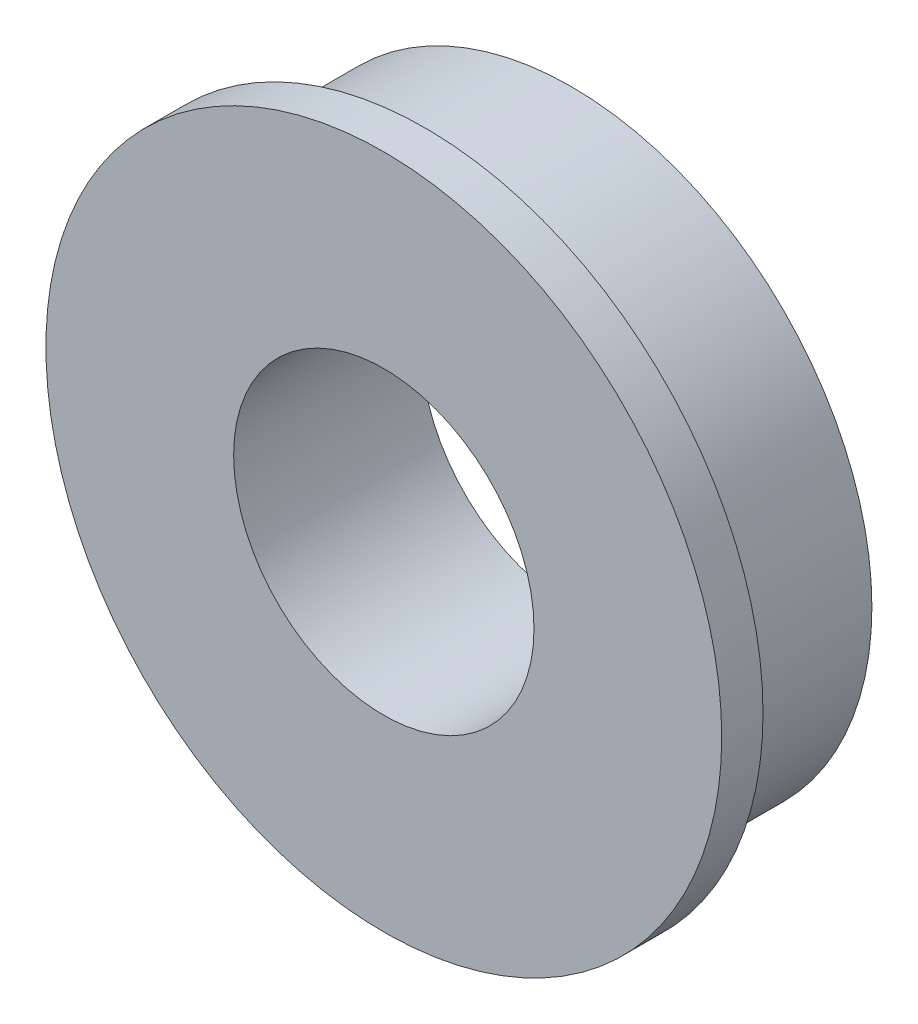
ISO-10303-21;
HEADER;
FILE_DESCRIPTION(('STEP AP214'),'2;1');
FILE_NAME('part.step','',(''),(''),'','','');
FILE_SCHEMA(('AUTOMOTIVE_DESIGN { 1 0 10303 214 1 1 1 1 }'));
ENDSEC;
DATA;
#1=APPLICATION_CONTEXT('core data for automotive mechanical design processes');
#2=APPLICATION_PROTOCOL_DEFINITION('international standard','automotive_design',2000,#1);
#3=PRODUCT_CONTEXT('',#1,'mechanical');
#4=PRODUCT('Part','Part','',(#3));
#5=PRODUCT_RELATED_PRODUCT_CATEGORY('part','',(#4));
#6=PRODUCT_DEFINITION_FORMATION('','',#4);
#7=PRODUCT_DEFINITION_CONTEXT('part definition',#1,'design');
#8=PRODUCT_DEFINITION('design','',#6,#7);
#9=PRODUCT_DEFINITION_SHAPE('','',#8);
#10=(LENGTH_UNIT() NAMED_UNIT(*) SI_UNIT(.MILLI.,.METRE.));
#11=(NAMED_UNIT(*) PLANE_ANGLE_UNIT() SI_UNIT($,.RADIAN.));
#12=(NAMED_UNIT(*) SI_UNIT($,.STERADIAN.) SOLID_ANGLE_UNIT());
#13=UNCERTAINTY_MEASURE_WITH_UNIT(LENGTH_MEASURE(1.E-05),#10,'distance_accuracy_value','');
#14=(GEOMETRIC_REPRESENTATION_CONTEXT(3) GLOBAL_UNCERTAINTY_ASSIGNED_CONTEXT((#13)) GLOBAL_UNIT_ASSIGNED_CONTEXT((#10,
#11,#12)) REPRESENTATION_CONTEXT('',''));
#15=CARTESIAN_POINT('',(0.,0.,0.));
#16=DIRECTION('',(0.,0.,1.));
#17=DIRECTION('',(1.,0.,0.));
#18=AXIS2_PLACEMENT_3D('',#15,#16,#17);
#19=CARTESIAN_POINT('',(0.,0.,1.1));
#20=DIRECTION('',(0.,0.,-1.));
#21=DIRECTION('',(-1.,0.,0.));
#22=AXIS2_PLACEMENT_3D('',#19,#20,#21);
#23=CYLINDRICAL_SURFACE('',#22,9.);
#24=CARTESIAN_POINT('',(0.,0.,1.1));
#25=DIRECTION('',(0.,0.,1.));
#26=DIRECTION('',(1.,0.,0.));
#27=AXIS2_PLACEMENT_3D('',#24,#25,#26);
#28=CIRCLE('',#27,9.);
#29=CARTESIAN_POINT('',(9.,0.,1.1));
#30=VERTEX_POINT('',#29);
#31=EDGE_CURVE('E39',#30,#30,#28,.T.);
#32=ORIENTED_EDGE('',*,*,#31,.F.);
#33=EDGE_LOOP('',(#32));
#34=FACE_BOUND('',#33,.T.);
#35=CARTESIAN_POINT('',(0.,0.,0.));
#36=DIRECTION('',(0.,0.,1.));
#37=DIRECTION('',(1.,0.,0.));
#38=AXIS2_PLACEMENT_3D('',#35,#36,#37);
#39=CIRCLE('',#38,9.);
#40=CARTESIAN_POINT('',(9.,0.,0.));
#41=VERTEX_POINT('',#40);
#42=EDGE_CURVE('E43',#41,#41,#39,.T.);
#43=ORIENTED_EDGE('',*,*,#42,.T.);
#44=EDGE_LOOP('',(#43));
#45=FACE_BOUND('',#44,.T.);
#46=ADVANCED_FACE('F33',(#34,#45),#23,.T.);
#47=CARTESIAN_POINT('',(0.,0.,1.1));
#48=DIRECTION('',(0.,0.,1.));
#49=DIRECTION('',(1.,0.,0.));
#50=AXIS2_PLACEMENT_3D('',#47,#48,#49);
#51=PLANE('',#50);
#52=CARTESIAN_POINT('',(0.,0.,1.1));
#53=DIRECTION('',(0.,0.,-1.));
#54=DIRECTION('',(-1.,0.,0.));
#55=AXIS2_PLACEMENT_3D('',#52,#53,#54);
#56=CIRCLE('',#55,4.);
#57=CARTESIAN_POINT('',(-4.,0.,1.1));
#58=VERTEX_POINT('',#57);
#59=EDGE_CURVE('E52',#58,#58,#56,.T.);
#60=ORIENTED_EDGE('',*,*,#59,.T.);
#61=EDGE_LOOP('',(#60));
#62=FACE_BOUND('',#61,.T.);
#63=ORIENTED_EDGE('',*,*,#31,.T.);
#64=EDGE_LOOP('',(#63));
#65=FACE_BOUND('',#64,.T.);
#66=ADVANCED_FACE('F59',(#62,#65),#51,.T.);
#67=CARTESIAN_POINT('',(0.,0.,0.));
#68=DIRECTION('',(0.,0.,1.));
#69=DIRECTION('',(1.,0.,0.));
#70=AXIS2_PLACEMENT_3D('',#67,#68,#69);
#71=PLANE('',#70);
#72=CARTESIAN_POINT('',(0.,0.,0.));
#73=DIRECTION('',(0.,0.,1.));
#74=DIRECTION('',(1.,0.,0.));
#75=AXIS2_PLACEMENT_3D('',#72,#73,#74);
#76=CIRCLE('',#75,8.);
#77=CARTESIAN_POINT('',(8.,0.,0.));
#78=VERTEX_POINT('',#77);
#79=EDGE_CURVE('E10',#78,#78,#76,.F.);
#80=ORIENTED_EDGE('',*,*,#79,.F.);
#81=EDGE_LOOP('',(#80));
#82=FACE_BOUND('',#81,.T.);
#83=ORIENTED_EDGE('',*,*,#42,.F.);
#84=EDGE_LOOP('',(#83));
#85=FACE_BOUND('',#84,.T.);
#86=ADVANCED_FACE('F75',(#82,#85),#71,.F.);
#87=CARTESIAN_POINT('',(0.,0.,-3.9));
#88=DIRECTION('',(0.,0.,1.));
#89=DIRECTION('',(1.,0.,0.));
#90=AXIS2_PLACEMENT_3D('',#87,#88,#89);
#91=CYLINDRICAL_SURFACE('',#90,8.);
#92=CARTESIAN_POINT('',(0.,0.,-3.9));
#93=DIRECTION('',(0.,0.,-1.));
#94=DIRECTION('',(-1.,0.,0.));
#95=AXIS2_PLACEMENT_3D('',#92,#93,#94);
#96=CIRCLE('',#95,8.);
#97=CARTESIAN_POINT('',(-8.,0.,-3.9));
#98=VERTEX_POINT('',#97);
#99=EDGE_CURVE('E48',#98,#98,#96,.T.);
#100=ORIENTED_EDGE('',*,*,#99,.F.);
#101=EDGE_LOOP('',(#100));
#102=FACE_BOUND('',#101,.T.);
#103=ORIENTED_EDGE('',*,*,#79,.T.);
#104=EDGE_LOOP('',(#103));
#105=FACE_BOUND('',#104,.T.);
#106=ADVANCED_FACE('F70',(#102,#105),#91,.T.);
#107=CARTESIAN_POINT('',(0.,0.,-3.9));
#108=DIRECTION('',(0.,0.,-1.));
#109=DIRECTION('',(-1.,0.,0.));
#110=AXIS2_PLACEMENT_3D('',#107,#108,#109);
#111=PLANE('',#110);
#112=CARTESIAN_POINT('',(0.,0.,-3.9));
#113=DIRECTION('',(0.,0.,-1.));
#114=DIRECTION('',(-1.,0.,0.));
#115=AXIS2_PLACEMENT_3D('',#112,#113,#114);
#116=CIRCLE('',#115,4.);
#117=CARTESIAN_POINT('',(-4.,0.,-3.9));
#118=VERTEX_POINT('',#117);
#119=EDGE_CURVE('E53',#118,#118,#116,.T.);
#120=ORIENTED_EDGE('',*,*,#119,.F.);
#121=EDGE_LOOP('',(#120));
#122=FACE_BOUND('',#121,.T.);
#123=ORIENTED_EDGE('',*,*,#99,.T.);
#124=EDGE_LOOP('',(#123));
#125=FACE_BOUND('',#124,.T.);
#126=ADVANCED_FACE('F64',(#122,#125),#111,.T.);
#127=CARTESIAN_POINT('',(0.,0.,1.1));
#128=DIRECTION('',(0.,0.,-1.));
#129=DIRECTION('',(-1.,0.,0.));
#130=AXIS2_PLACEMENT_3D('',#127,#128,#129);
#131=CYLINDRICAL_SURFACE('',#130,4.);
#132=ORIENTED_EDGE('',*,*,#59,.F.);
#133=EDGE_LOOP('',(#132));
#134=FACE_BOUND('',#133,.T.);
#135=ORIENTED_EDGE('',*,*,#119,.T.);
#136=EDGE_LOOP('',(#135));
#137=FACE_BOUND('',#136,.T.);
#138=ADVANCED_FACE('F61',(#134,#137),#131,.F.);
#139=CLOSED_SHELL('',(#46,#66,#86,#106,#126,#138));
#140=MANIFOLD_SOLID_BREP('B2',#139);
#141=ADVANCED_BREP_SHAPE_REPRESENTATION('',(#18,#140),#14);
#142=SHAPE_DEFINITION_REPRESENTATION(#9,#141);
ENDSEC;
END-ISO-10303-21;
